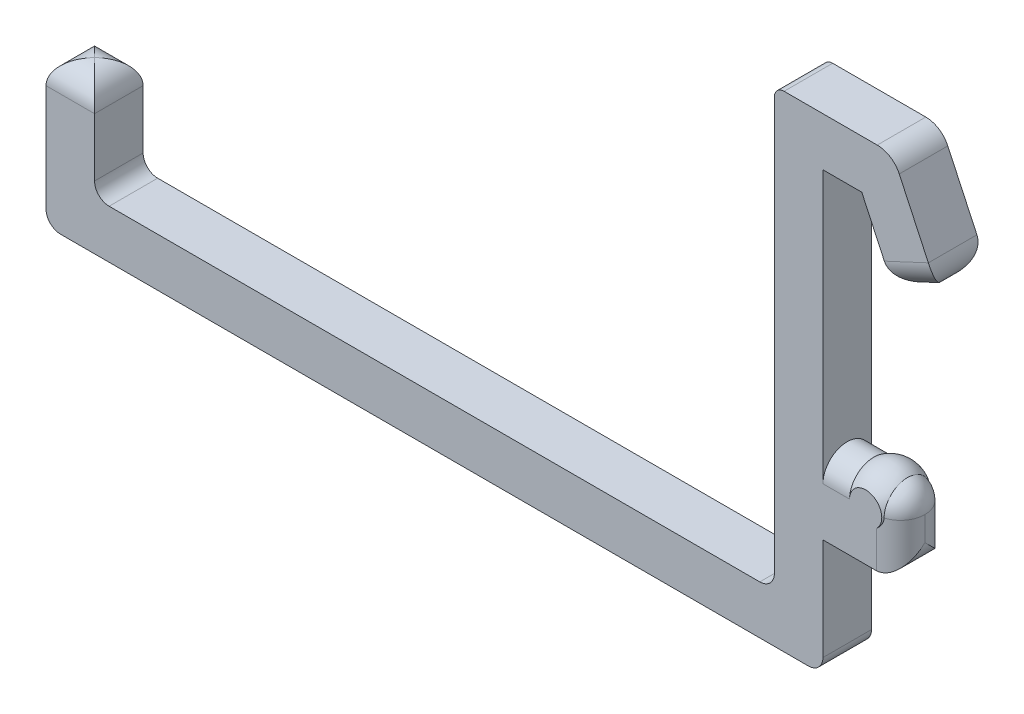
ISO-10303-21;
HEADER;
FILE_DESCRIPTION(('STEP AP214'),'2;1');
FILE_NAME('part.step','',(''),(''),'','','');
FILE_SCHEMA(('AUTOMOTIVE_DESIGN { 1 0 10303 214 1 1 1 1 }'));
ENDSEC;
DATA;
#1=APPLICATION_CONTEXT('core data for automotive mechanical design processes');
#2=APPLICATION_PROTOCOL_DEFINITION('international standard','automotive_design',2000,#1);
#3=PRODUCT_CONTEXT('',#1,'mechanical');
#4=PRODUCT('Part','Part','',(#3));
#5=PRODUCT_RELATED_PRODUCT_CATEGORY('part','',(#4));
#6=PRODUCT_DEFINITION_FORMATION('','',#4);
#7=PRODUCT_DEFINITION_CONTEXT('part definition',#1,'design');
#8=PRODUCT_DEFINITION('design','',#6,#7);
#9=PRODUCT_DEFINITION_SHAPE('','',#8);
#10=(LENGTH_UNIT() NAMED_UNIT(*) SI_UNIT(.MILLI.,.METRE.));
#11=(NAMED_UNIT(*) PLANE_ANGLE_UNIT() SI_UNIT($,.RADIAN.));
#12=(NAMED_UNIT(*) SI_UNIT($,.STERADIAN.) SOLID_ANGLE_UNIT());
#13=UNCERTAINTY_MEASURE_WITH_UNIT(LENGTH_MEASURE(1.E-05),#10,'distance_accuracy_value','');
#14=(GEOMETRIC_REPRESENTATION_CONTEXT(3) GLOBAL_UNCERTAINTY_ASSIGNED_CONTEXT((#13)) GLOBAL_UNIT_ASSIGNED_CONTEXT((#10,
#11,#12)) REPRESENTATION_CONTEXT('',''));
#15=CARTESIAN_POINT('',(0.,0.,0.));
#16=DIRECTION('',(0.,0.,1.));
#17=DIRECTION('',(1.,0.,0.));
#18=AXIS2_PLACEMENT_3D('',#15,#16,#17);
#19=CARTESIAN_POINT('',(13.5901699437495,0.,2.5));
#20=DIRECTION('',(-1.,0.,0.));
#21=DIRECTION('',(0.,0.,1.));
#22=AXIS2_PLACEMENT_3D('',#19,#20,#21);
#23=CYLINDRICAL_SURFACE('',#22,2.5);
#24=CARTESIAN_POINT('',(2.7416876048223,0.,2.5));
#25=DIRECTION('',(1.,0.,0.));
#26=DIRECTION('',(0.,0.,-1.));
#27=AXIS2_PLACEMENT_3D('',#24,#25,#26);
#28=CIRCLE('',#27,2.5);
#29=CARTESIAN_POINT('',(2.7416876048223,0.,0.));
#30=VERTEX_POINT('',#29);
#31=CARTESIAN_POINT('',(2.7416876048223,0.,5.));
#32=VERTEX_POINT('',#31);
#33=EDGE_CURVE('E235',#30,#32,#28,.T.);
#34=ORIENTED_EDGE('',*,*,#33,.F.);
#35=DIRECTION('',(-1.,0.,0.));
#36=VECTOR('',#35,1.);
#37=CARTESIAN_POINT('',(0.,0.,0.));
#38=LINE('',#37,#36);
#39=CARTESIAN_POINT('',(0.,0.,0.));
#40=VERTEX_POINT('',#39);
#41=EDGE_CURVE('E310',#30,#40,#38,.T.);
#42=ORIENTED_EDGE('',*,*,#41,.T.);
#43=CARTESIAN_POINT('',(0.,0.,2.5));
#44=DIRECTION('',(1.,0.,0.));
#45=DIRECTION('',(0.,0.,-1.));
#46=AXIS2_PLACEMENT_3D('',#43,#44,#45);
#47=CIRCLE('',#46,2.5);
#48=CARTESIAN_POINT('',(0.,0.,5.));
#49=VERTEX_POINT('',#48);
#50=EDGE_CURVE('E440',#40,#49,#47,.T.);
#51=ORIENTED_EDGE('',*,*,#50,.T.);
#52=DIRECTION('',(-1.,0.,0.));
#53=VECTOR('',#52,1.);
#54=CARTESIAN_POINT('',(0.,0.,5.));
#55=LINE('',#54,#53);
#56=EDGE_CURVE('E312',#32,#49,#55,.T.);
#57=ORIENTED_EDGE('',*,*,#56,.F.);
#58=EDGE_LOOP('',(#34,#42,#51,#57));
#59=FACE_BOUND('',#58,.T.);
#60=ADVANCED_FACE('F38',(#59),#23,.T.);
#61=CARTESIAN_POINT('',(5.5,0.,2.5));
#62=DIRECTION('',(0.,-1.,0.));
#63=DIRECTION('',(0.,0.,-1.));
#64=AXIS2_PLACEMENT_3D('',#61,#62,#63);
#65=CYLINDRICAL_SURFACE('',#64,2.5);
#66=DIRECTION('',(0.,1.,0.));
#67=VECTOR('',#66,1.);
#68=CARTESIAN_POINT('',(5.5,-5.,0.));
#69=LINE('',#68,#67);
#70=CARTESIAN_POINT('',(5.5,-1.24096736459909,0.));
#71=VERTEX_POINT('',#70);
#72=CARTESIAN_POINT('',(5.5,-5.,0.));
#73=VERTEX_POINT('',#72);
#74=EDGE_CURVE('E226',#71,#73,#69,.F.);
#75=ORIENTED_EDGE('',*,*,#74,.F.);
#76=CARTESIAN_POINT('',(5.4998,-1.24114463299005,8.00000016901504E-09));
#77=CARTESIAN_POINT('',(5.5363929673262,-1.2087029649529,-9.26164938524013E-06));
#78=CARTESIAN_POINT('',(5.57236876038989,-1.17555626849876,0.00079770122016531));
#79=CARTESIAN_POINT('',(5.6428030561148,-1.10769667819631,0.00383433659862395));
#80=CARTESIAN_POINT('',(5.67726031215857,-1.07298254322827,0.0060651555671746));
#81=CARTESIAN_POINT('',(5.74519128912905,-1.00095424317269,0.0118132669352872));
#82=CARTESIAN_POINT('',(5.77861573042543,-0.963595826296857,0.0153626740978217));
#83=CARTESIAN_POINT('',(5.84305795009588,-0.886981329738944,0.0234356736079334));
#84=CARTESIAN_POINT('',(5.8740762229525,-0.847725642663384,0.0279590650703918));
#85=CARTESIAN_POINT('',(5.96325201148396,-0.726269508254624,0.042561851108955));
#86=CARTESIAN_POINT('',(6.01705538420124,-0.640865596374251,0.0536260746175859));
#87=CARTESIAN_POINT('',(6.10655009460944,-0.461922147892546,0.074258393974845));
#88=CARTESIAN_POINT('',(6.14249859084772,-0.368522297372846,0.0838462716282918));
#89=CARTESIAN_POINT('',(6.17730370336194,-0.227795718404401,0.0934686773099391));
#90=CARTESIAN_POINT('',(6.18570287472368,-0.1829602446012,0.0958641595546958));
#91=CARTESIAN_POINT('',(6.19710907659667,-0.0920455434275466,0.0991560697495525));
#92=CARTESIAN_POINT('',(6.20005395659277,-0.0459579806521387,0.100035211650277));
#93=CARTESIAN_POINT('',(6.19999998181818,0.000200000000000188,0.0999999946969703));
#94=B_SPLINE_CURVE_WITH_KNOTS('',3,(#76,#77,#78,#79,#80,#81,#82,#83,#84,#85,#86,#87,#88,#89,#90,
#91,#92,#93),.UNSPECIFIED.,.F.,.F.,(4,2,2,2,2,2,2,2,4),(0.,0.146701218214616,0.29352070649968,
0.444179394748281,0.594807039223552,0.898088830284032,1.196865790681,1.3335683412279,
1.47181922641049),.UNSPECIFIED.);
#95=CARTESIAN_POINT('',(6.2,0.,0.100000000000001));
#96=VERTEX_POINT('',#95);
#97=EDGE_CURVE('E271',#71,#96,#94,.T.);
#98=ORIENTED_EDGE('',*,*,#97,.T.);
#99=CARTESIAN_POINT('',(5.5,0.,2.5));
#100=DIRECTION('',(0.,1.,0.));
#101=DIRECTION('',(0.,0.,1.));
#102=AXIS2_PLACEMENT_3D('',#99,#100,#101);
#103=CIRCLE('',#102,2.5);
#104=CARTESIAN_POINT('',(8.,0.,2.5));
#105=VERTEX_POINT('',#104);
#106=EDGE_CURVE('E471',#105,#96,#103,.T.);
#107=ORIENTED_EDGE('',*,*,#106,.F.);
#108=DIRECTION('',(0.,1.,0.));
#109=VECTOR('',#108,1.);
#110=CARTESIAN_POINT('',(8.,0.,2.5));
#111=LINE('',#110,#109);
#112=CARTESIAN_POINT('',(8.,-2.5,2.5));
#113=VERTEX_POINT('',#112);
#114=EDGE_CURVE('E469',#113,#105,#111,.T.);
#115=ORIENTED_EDGE('',*,*,#114,.F.);
#116=CARTESIAN_POINT('',(5.5,-2.5,2.5));
#117=DIRECTION('',(0.,0.707106781186547,-0.707106781186547));
#118=DIRECTION('',(0.,-0.707106781186547,-0.707106781186547));
#119=AXIS2_PLACEMENT_3D('',#116,#117,#118);
#120=ELLIPSE('',#119,3.53553390593274,2.5);
#121=EDGE_CURVE('E257',#73,#113,#120,.F.);
#122=ORIENTED_EDGE('',*,*,#121,.F.);
#123=EDGE_LOOP('',(#75,#98,#107,#115,#122));
#124=FACE_BOUND('',#123,.T.);
#125=ADVANCED_FACE('F283',(#124),#65,.T.);
#126=CARTESIAN_POINT('',(5.5,0.,2.5));
#127=DIRECTION('',(-1.,0.,0.));
#128=DIRECTION('',(0.,0.,1.));
#129=AXIS2_PLACEMENT_3D('',#126,#127,#128);
#130=SPHERICAL_SURFACE('',#129,2.5);
#131=ORIENTED_EDGE('',*,*,#106,.T.);
#132=CARTESIAN_POINT('',(6.2,0.,2.5));
#133=DIRECTION('',(-1.,0.,0.));
#134=DIRECTION('',(0.,0.,1.));
#135=AXIS2_PLACEMENT_3D('',#132,#133,#134);
#136=CIRCLE('',#135,2.4);
#137=CARTESIAN_POINT('',(6.2,0.,4.9));
#138=VERTEX_POINT('',#137);
#139=EDGE_CURVE('E281',#96,#138,#136,.F.);
#140=ORIENTED_EDGE('',*,*,#139,.T.);
#141=CARTESIAN_POINT('',(5.5,0.,2.5));
#142=DIRECTION('',(0.,-1.,0.));
#143=DIRECTION('',(0.,0.,-1.));
#144=AXIS2_PLACEMENT_3D('',#141,#142,#143);
#145=CIRCLE('',#144,2.5);
#146=EDGE_CURVE('E244',#105,#138,#145,.T.);
#147=ORIENTED_EDGE('',*,*,#146,.F.);
#148=EDGE_LOOP('',(#131,#140,#147));
#149=FACE_BOUND('',#148,.T.);
#150=ADVANCED_FACE('F288',(#149),#130,.T.);
#151=CARTESIAN_POINT('',(5.5,0.,2.5));
#152=DIRECTION('',(0.,1.,0.));
#153=DIRECTION('',(0.,0.,1.));
#154=AXIS2_PLACEMENT_3D('',#151,#152,#153);
#155=CYLINDRICAL_SURFACE('',#154,2.5);
#156=ORIENTED_EDGE('',*,*,#146,.T.);
#157=CARTESIAN_POINT('',(6.19999998181818,0.0002,4.90000000530303));
#158=CARTESIAN_POINT('',(6.20002060593483,-0.0340215820751625,4.8999881731683));
#159=CARTESIAN_POINT('',(6.1984143593459,-0.0682209096207422,4.90046286433432));
#160=CARTESIAN_POINT('',(6.19208379810463,-0.136249463080852,4.90229830533756));
#161=CARTESIAN_POINT('',(6.18736474729119,-0.170079215952131,4.90365755930238));
#162=CARTESIAN_POINT('',(6.1689482938362,-0.269536910764676,4.90887369332737));
#163=CARTESIAN_POINT('',(6.15098131886339,-0.334336983187606,4.91387497360715));
#164=CARTESIAN_POINT('',(6.09808868579219,-0.480851170246759,4.92759913373652));
#165=CARTESIAN_POINT('',(6.05953499991633,-0.561148858343043,4.9370045157109));
#166=CARTESIAN_POINT('',(5.97007827325949,-0.715449277029459,4.95583685420229));
#167=CARTESIAN_POINT('',(5.91904380010561,-0.789372868652353,4.96526290588241));
#168=CARTESIAN_POINT('',(5.80922506209963,-0.929818254648964,4.98141526656959));
#169=CARTESIAN_POINT('',(5.75055545651682,-0.996426935956446,4.98817650123594));
#170=CARTESIAN_POINT('',(5.65870838300495,-1.09170672728009,4.99514321976577));
#171=CARTESIAN_POINT('',(5.62774086496115,-1.12244386881611,4.99693401300135));
#172=CARTESIAN_POINT('',(5.56461568283012,-1.1826876244331,4.99936451304459));
#173=CARTESIAN_POINT('',(5.5324586096933,-1.21219483443042,5.00000478377816));
#174=CARTESIAN_POINT('',(5.4998,-1.24114463299005,4.999999992));
#175=B_SPLINE_CURVE_WITH_KNOTS('',3,(#157,#158,#159,#160,#161,#162,#163,#164,#165,#166,#167,
#168,#169,#170,#171,#172,#173,#174),.UNSPECIFIED.,.F.,.F.,(4,2,2,2,2,2,2,2,4),(0.,
0.102583403755103,0.204993779301411,0.406260766109181,0.673486519863846,0.943657669752398,
1.21015973265302,1.34112701736425,1.47203009124063),.UNSPECIFIED.);
#176=CARTESIAN_POINT('',(5.5,-1.24096736459909,5.));
#177=VERTEX_POINT('',#176);
#178=EDGE_CURVE('E232',#138,#177,#175,.T.);
#179=ORIENTED_EDGE('',*,*,#178,.T.);
#180=DIRECTION('',(0.,1.,0.));
#181=VECTOR('',#180,1.);
#182=CARTESIAN_POINT('',(5.5,0.,5.));
#183=LINE('',#182,#181);
#184=CARTESIAN_POINT('',(5.5,-5.,5.));
#185=VERTEX_POINT('',#184);
#186=EDGE_CURVE('E214',#185,#177,#183,.T.);
#187=ORIENTED_EDGE('',*,*,#186,.F.);
#188=CARTESIAN_POINT('',(5.5,-2.5,2.5));
#189=DIRECTION('',(0.,-0.707106781186547,-0.707106781186547));
#190=DIRECTION('',(0.,0.707106781186547,-0.707106781186547));
#191=AXIS2_PLACEMENT_3D('',#188,#189,#190);
#192=ELLIPSE('',#191,3.53553390593274,2.5);
#193=EDGE_CURVE('E466',#185,#113,#192,.F.);
#194=ORIENTED_EDGE('',*,*,#193,.T.);
#195=ORIENTED_EDGE('',*,*,#114,.T.);
#196=EDGE_LOOP('',(#156,#179,#187,#194,#195));
#197=FACE_BOUND('',#196,.T.);
#198=ADVANCED_FACE('F241',(#197),#155,.T.);
#199=CARTESIAN_POINT('',(0.,0.,5.));
#200=DIRECTION('',(-1.,0.,0.));
#201=DIRECTION('',(0.,0.,1.));
#202=AXIS2_PLACEMENT_3D('',#199,#200,#201);
#203=PLANE('',#202);
#204=ORIENTED_EDGE('',*,*,#50,.F.);
#205=DIRECTION('',(0.,1.,0.));
#206=VECTOR('',#205,1.);
#207=CARTESIAN_POINT('',(0.,0.,0.));
#208=LINE('',#207,#206);
#209=CARTESIAN_POINT('',(0.,28.,0.));
#210=VERTEX_POINT('',#209);
#211=EDGE_CURVE('E318',#40,#210,#208,.T.);
#212=ORIENTED_EDGE('',*,*,#211,.T.);
#213=DIRECTION('',(0.,0.,-1.));
#214=VECTOR('',#213,1.);
#215=CARTESIAN_POINT('',(0.,28.,5.));
#216=LINE('',#215,#214);
#217=CARTESIAN_POINT('',(0.,28.,5.));
#218=VERTEX_POINT('',#217);
#219=EDGE_CURVE('E379',#218,#210,#216,.T.);
#220=ORIENTED_EDGE('',*,*,#219,.F.);
#221=DIRECTION('',(0.,1.,0.));
#222=VECTOR('',#221,1.);
#223=CARTESIAN_POINT('',(0.,0.,5.));
#224=LINE('',#223,#222);
#225=EDGE_CURVE('E484',#49,#218,#224,.T.);
#226=ORIENTED_EDGE('',*,*,#225,.F.);
#227=EDGE_LOOP('',(#204,#212,#220,#226));
#228=FACE_BOUND('',#227,.T.);
#229=ADVANCED_FACE('F676',(#228),#203,.F.);
#230=CARTESIAN_POINT('',(0.,28.,5.));
#231=DIRECTION('',(0.,1.,0.));
#232=DIRECTION('',(0.,0.,1.));
#233=AXIS2_PLACEMENT_3D('',#230,#231,#232);
#234=PLANE('',#233);
#235=DIRECTION('',(1.,0.,0.));
#236=VECTOR('',#235,1.);
#237=CARTESIAN_POINT('',(0.,28.,0.));
#238=LINE('',#237,#236);
#239=CARTESIAN_POINT('',(4.,28.,0.));
#240=VERTEX_POINT('',#239);
#241=EDGE_CURVE('E325',#210,#240,#238,.T.);
#242=ORIENTED_EDGE('',*,*,#241,.T.);
#243=DIRECTION('',(0.,0.,-1.));
#244=VECTOR('',#243,1.);
#245=CARTESIAN_POINT('',(4.,28.,5.));
#246=LINE('',#245,#244);
#247=CARTESIAN_POINT('',(4.,28.,5.));
#248=VERTEX_POINT('',#247);
#249=EDGE_CURVE('E375',#248,#240,#246,.T.);
#250=ORIENTED_EDGE('',*,*,#249,.F.);
#251=DIRECTION('',(1.,0.,0.));
#252=VECTOR('',#251,1.);
#253=CARTESIAN_POINT('',(0.,28.,5.));
#254=LINE('',#253,#252);
#255=EDGE_CURVE('E487',#218,#248,#254,.T.);
#256=ORIENTED_EDGE('',*,*,#255,.F.);
#257=ORIENTED_EDGE('',*,*,#219,.T.);
#258=EDGE_LOOP('',(#242,#250,#256,#257));
#259=FACE_BOUND('',#258,.T.);
#260=ADVANCED_FACE('F672',(#259),#234,.F.);
#261=CARTESIAN_POINT('',(4.,28.,5.));
#262=DIRECTION('',(0.906307787036651,0.422618261740697,0.));
#263=DIRECTION('',(-0.422618261740697,0.906307787036651,0.));
#264=AXIS2_PLACEMENT_3D('',#261,#262,#263);
#265=PLANE('',#264);
#266=DIRECTION('',(0.422618261740697,-0.906307787036651,0.));
#267=VECTOR('',#266,1.);
#268=CARTESIAN_POINT('',(4.,28.,0.));
#269=LINE('',#268,#267);
#270=CARTESIAN_POINT('',(6.32440043957384,23.0153071712984,0.));
#271=VERTEX_POINT('',#270);
#272=EDGE_CURVE('E335',#240,#271,#269,.T.);
#273=ORIENTED_EDGE('',*,*,#272,.T.);
#274=DIRECTION('',(0.,0.,-1.));
#275=VECTOR('',#274,1.);
#276=CARTESIAN_POINT('',(6.32440043957383,23.0153071712984,5.));
#277=LINE('',#276,#275);
#278=CARTESIAN_POINT('',(6.32440043957384,23.0153071712984,5.));
#279=VERTEX_POINT('',#278);
#280=EDGE_CURVE('E383',#271,#279,#277,.F.);
#281=ORIENTED_EDGE('',*,*,#280,.T.);
#282=DIRECTION('',(0.422618261740697,-0.906307787036651,0.));
#283=VECTOR('',#282,1.);
#284=CARTESIAN_POINT('',(4.,28.,5.));
#285=LINE('',#284,#283);
#286=EDGE_CURVE('E490',#248,#279,#285,.T.);
#287=ORIENTED_EDGE('',*,*,#286,.F.);
#288=ORIENTED_EDGE('',*,*,#249,.T.);
#289=EDGE_LOOP('',(#273,#281,#287,#288));
#290=FACE_BOUND('',#289,.T.);
#291=ADVANCED_FACE('F667',(#290),#265,.F.);
#292=CARTESIAN_POINT('',(11.9124850291088,22.8626290124103,5.));
#293=DIRECTION('',(-0.906307787036651,-0.422618261740697,0.));
#294=DIRECTION('',(0.422618261740697,-0.906307787036651,0.));
#295=AXIS2_PLACEMENT_3D('',#292,#293,#294);
#296=PLANE('',#295);
#297=DIRECTION('',(-0.422618261740697,0.906307787036651,0.));
#298=VECTOR('',#297,1.);
#299=CARTESIAN_POINT('',(11.9124850291088,22.8626290124103,5.));
#300=LINE('',#299,#298);
#301=CARTESIAN_POINT('',(10.8559393747571,25.1283984800019,5.));
#302=VERTEX_POINT('',#301);
#303=CARTESIAN_POINT('',(7.85844511961037,31.5565456543517,5.));
#304=VERTEX_POINT('',#303);
#305=EDGE_CURVE('E494',#302,#304,#300,.T.);
#306=ORIENTED_EDGE('',*,*,#305,.F.);
#307=DIRECTION('',(0.,0.,-1.));
#308=VECTOR('',#307,1.);
#309=CARTESIAN_POINT('',(10.8559393747571,25.1283984800019,5.));
#310=LINE('',#309,#308);
#311=CARTESIAN_POINT('',(10.8559393747571,25.1283984800019,0.));
#312=VERTEX_POINT('',#311);
#313=EDGE_CURVE('E399',#302,#312,#310,.T.);
#314=ORIENTED_EDGE('',*,*,#313,.T.);
#315=DIRECTION('',(-0.422618261740697,0.906307787036651,0.));
#316=VECTOR('',#315,1.);
#317=CARTESIAN_POINT('',(11.9124850291088,22.8626290124103,0.));
#318=LINE('',#317,#316);
#319=CARTESIAN_POINT('',(7.85844511961037,31.5565456543517,0.));
#320=VERTEX_POINT('',#319);
#321=EDGE_CURVE('E339',#312,#320,#318,.T.);
#322=ORIENTED_EDGE('',*,*,#321,.T.);
#323=DIRECTION('',(0.,0.,-1.));
#324=VECTOR('',#323,1.);
#325=CARTESIAN_POINT('',(7.85844511961037,31.5565456543517,5.));
#326=LINE('',#325,#324);
#327=EDGE_CURVE('E396',#320,#304,#326,.F.);
#328=ORIENTED_EDGE('',*,*,#327,.T.);
#329=EDGE_LOOP('',(#306,#314,#322,#328));
#330=FACE_BOUND('',#329,.T.);
#331=ADVANCED_FACE('F653',(#330),#296,.F.);
#332=CARTESIAN_POINT('',(-5.,33.,5.));
#333=DIRECTION('',(0.,-1.,0.));
#334=DIRECTION('',(0.,0.,-1.));
#335=AXIS2_PLACEMENT_3D('',#332,#333,#334);
#336=PLANE('',#335);
#337=DIRECTION('',(-1.,0.,0.));
#338=VECTOR('',#337,1.);
#339=CARTESIAN_POINT('',(-5.,33.,0.));
#340=LINE('',#339,#338);
#341=CARTESIAN_POINT('',(5.59267565201873,33.,0.));
#342=VERTEX_POINT('',#341);
#343=CARTESIAN_POINT('',(-4.,33.,0.));
#344=VERTEX_POINT('',#343);
#345=EDGE_CURVE('E343',#342,#344,#340,.T.);
#346=ORIENTED_EDGE('',*,*,#345,.T.);
#347=DIRECTION('',(0.,0.,-1.));
#348=VECTOR('',#347,1.);
#349=CARTESIAN_POINT('',(-4.,33.,5.));
#350=LINE('',#349,#348);
#351=CARTESIAN_POINT('',(-4.,33.,5.));
#352=VERTEX_POINT('',#351);
#353=EDGE_CURVE('E457',#344,#352,#350,.F.);
#354=ORIENTED_EDGE('',*,*,#353,.T.);
#355=DIRECTION('',(-1.,0.,0.));
#356=VECTOR('',#355,1.);
#357=CARTESIAN_POINT('',(-5.,33.,5.));
#358=LINE('',#357,#356);
#359=CARTESIAN_POINT('',(5.59267565201873,33.,5.));
#360=VERTEX_POINT('',#359);
#361=EDGE_CURVE('E498',#360,#352,#358,.T.);
#362=ORIENTED_EDGE('',*,*,#361,.F.);
#363=DIRECTION('',(0.,0.,-1.));
#364=VECTOR('',#363,1.);
#365=CARTESIAN_POINT('',(5.59267565201874,33.,5.));
#366=LINE('',#365,#364);
#367=EDGE_CURVE('E419',#360,#342,#366,.T.);
#368=ORIENTED_EDGE('',*,*,#367,.T.);
#369=EDGE_LOOP('',(#346,#354,#362,#368));
#370=FACE_BOUND('',#369,.T.);
#371=ADVANCED_FACE('F645',(#370),#336,.F.);
#372=CARTESIAN_POINT('',(-5.,33.,5.));
#373=DIRECTION('',(1.,0.,0.));
#374=DIRECTION('',(0.,1.,0.));
#375=AXIS2_PLACEMENT_3D('',#372,#373,#374);
#376=PLANE('',#375);
#377=DIRECTION('',(0.,-1.,0.));
#378=VECTOR('',#377,1.);
#379=CARTESIAN_POINT('',(-5.,33.,0.));
#380=LINE('',#379,#378);
#381=CARTESIAN_POINT('',(-5.,32.,0.));
#382=VERTEX_POINT('',#381);
#383=CARTESIAN_POINT('',(-4.99999999999999,-10.5,0.));
#384=VERTEX_POINT('',#383);
#385=EDGE_CURVE('E347',#382,#384,#380,.T.);
#386=ORIENTED_EDGE('',*,*,#385,.T.);
#387=DIRECTION('',(0.,0.,-1.));
#388=VECTOR('',#387,1.);
#389=CARTESIAN_POINT('',(-4.99999999999999,-10.5,5.));
#390=LINE('',#389,#388);
#391=CARTESIAN_POINT('',(-4.99999999999999,-10.5,5.));
#392=VERTEX_POINT('',#391);
#393=EDGE_CURVE('E571',#384,#392,#390,.F.);
#394=ORIENTED_EDGE('',*,*,#393,.T.);
#395=DIRECTION('',(0.,-1.,0.));
#396=VECTOR('',#395,1.);
#397=CARTESIAN_POINT('',(-5.,33.,5.));
#398=LINE('',#397,#396);
#399=CARTESIAN_POINT('',(-5.,32.,5.));
#400=VERTEX_POINT('',#399);
#401=EDGE_CURVE('E502',#400,#392,#398,.T.);
#402=ORIENTED_EDGE('',*,*,#401,.F.);
#403=DIRECTION('',(0.,0.,-1.));
#404=VECTOR('',#403,1.);
#405=CARTESIAN_POINT('',(-5.,32.,5.));
#406=LINE('',#405,#404);
#407=EDGE_CURVE('E423',#400,#382,#406,.T.);
#408=ORIENTED_EDGE('',*,*,#407,.T.);
#409=EDGE_LOOP('',(#386,#394,#402,#408));
#410=FACE_BOUND('',#409,.T.);
#411=ADVANCED_FACE('F640',(#410),#376,.F.);
#412=CARTESIAN_POINT('',(-75.,-12.,5.));
#413=DIRECTION('',(0.,-1.,0.));
#414=DIRECTION('',(0.,0.,-1.));
#415=AXIS2_PLACEMENT_3D('',#412,#413,#414);
#416=PLANE('',#415);
#417=DIRECTION('',(-1.,0.,0.));
#418=VECTOR('',#417,1.);
#419=CARTESIAN_POINT('',(-75.,-12.,5.));
#420=LINE('',#419,#418);
#421=CARTESIAN_POINT('',(-6.50000000000001,-12.,5.));
#422=VERTEX_POINT('',#421);
#423=CARTESIAN_POINT('',(-73.5,-12.,5.));
#424=VERTEX_POINT('',#423);
#425=EDGE_CURVE('E506',#422,#424,#420,.T.);
#426=ORIENTED_EDGE('',*,*,#425,.F.);
#427=DIRECTION('',(0.,0.,-1.));
#428=VECTOR('',#427,1.);
#429=CARTESIAN_POINT('',(-6.50000000000001,-12.,0.));
#430=LINE('',#429,#428);
#431=CARTESIAN_POINT('',(-6.50000000000001,-12.,0.));
#432=VERTEX_POINT('',#431);
#433=EDGE_CURVE('E574',#422,#432,#430,.T.);
#434=ORIENTED_EDGE('',*,*,#433,.T.);
#435=DIRECTION('',(-1.,0.,0.));
#436=VECTOR('',#435,1.);
#437=CARTESIAN_POINT('',(-75.,-12.,0.));
#438=LINE('',#437,#436);
#439=CARTESIAN_POINT('',(-73.5,-12.,0.));
#440=VERTEX_POINT('',#439);
#441=EDGE_CURVE('E351',#432,#440,#438,.T.);
#442=ORIENTED_EDGE('',*,*,#441,.T.);
#443=DIRECTION('',(0.,0.,-1.));
#444=VECTOR('',#443,1.);
#445=CARTESIAN_POINT('',(-73.5,-12.,5.));
#446=LINE('',#445,#444);
#447=EDGE_CURVE('E578',#440,#424,#446,.F.);
#448=ORIENTED_EDGE('',*,*,#447,.T.);
#449=EDGE_LOOP('',(#426,#434,#442,#448));
#450=FACE_BOUND('',#449,.T.);
#451=ADVANCED_FACE('F584',(#450),#416,.F.);
#452=CARTESIAN_POINT('',(-75.,-12.,5.));
#453=DIRECTION('',(-1.,0.,0.));
#454=DIRECTION('',(0.,0.,1.));
#455=AXIS2_PLACEMENT_3D('',#452,#453,#454);
#456=PLANE('',#455);
#457=DIRECTION('',(0.,1.,0.));
#458=VECTOR('',#457,1.);
#459=CARTESIAN_POINT('',(-75.,-12.,5.));
#460=LINE('',#459,#458);
#461=CARTESIAN_POINT('',(-75.,-10.5,5.));
#462=VERTEX_POINT('',#461);
#463=CARTESIAN_POINT('',(-75.,-4.5,5.));
#464=VERTEX_POINT('',#463);
#465=EDGE_CURVE('E510',#462,#464,#460,.T.);
#466=ORIENTED_EDGE('',*,*,#465,.F.);
#467=DIRECTION('',(0.,0.,-1.));
#468=VECTOR('',#467,1.);
#469=CARTESIAN_POINT('',(-75.,-10.5,0.));
#470=LINE('',#469,#468);
#471=CARTESIAN_POINT('',(-75.,-10.5,0.));
#472=VERTEX_POINT('',#471);
#473=EDGE_CURVE('E567',#462,#472,#470,.T.);
#474=ORIENTED_EDGE('',*,*,#473,.T.);
#475=DIRECTION('',(0.,1.,0.));
#476=VECTOR('',#475,1.);
#477=CARTESIAN_POINT('',(-75.,-12.,0.));
#478=LINE('',#477,#476);
#479=CARTESIAN_POINT('',(-75.,-4.5,0.));
#480=VERTEX_POINT('',#479);
#481=EDGE_CURVE('E355',#472,#480,#478,.T.);
#482=ORIENTED_EDGE('',*,*,#481,.T.);
#483=DIRECTION('',(0.,0.,-1.));
#484=VECTOR('',#483,1.);
#485=CARTESIAN_POINT('',(-75.,-4.5,5.));
#486=LINE('',#485,#484);
#487=EDGE_CURVE('E412',#480,#464,#486,.F.);
#488=ORIENTED_EDGE('',*,*,#487,.T.);
#489=EDGE_LOOP('',(#466,#474,#482,#488));
#490=FACE_BOUND('',#489,.T.);
#491=ADVANCED_FACE('F593',(#490),#456,.F.);
#492=CARTESIAN_POINT('',(-80.,-2.,5.));
#493=DIRECTION('',(1.,0.,0.));
#494=DIRECTION('',(0.,0.,-1.));
#495=AXIS2_PLACEMENT_3D('',#492,#493,#494);
#496=PLANE('',#495);
#497=DIRECTION('',(0.,-1.,0.));
#498=VECTOR('',#497,1.);
#499=CARTESIAN_POINT('',(-80.,-2.,0.));
#500=LINE('',#499,#498);
#501=CARTESIAN_POINT('',(-80.,-4.5,0.));
#502=VERTEX_POINT('',#501);
#503=CARTESIAN_POINT('',(-80.,-15.5,0.));
#504=VERTEX_POINT('',#503);
#505=EDGE_CURVE('E358',#502,#504,#500,.T.);
#506=ORIENTED_EDGE('',*,*,#505,.T.);
#507=DIRECTION('',(0.,0.,-1.));
#508=VECTOR('',#507,1.);
#509=CARTESIAN_POINT('',(-80.,-15.5,5.));
#510=LINE('',#509,#508);
#511=CARTESIAN_POINT('',(-80.,-15.5,5.));
#512=VERTEX_POINT('',#511);
#513=EDGE_CURVE('E11',#504,#512,#510,.F.);
#514=ORIENTED_EDGE('',*,*,#513,.T.);
#515=DIRECTION('',(0.,-1.,0.));
#516=VECTOR('',#515,1.);
#517=CARTESIAN_POINT('',(-80.,-2.,5.));
#518=LINE('',#517,#516);
#519=CARTESIAN_POINT('',(-80.,-4.5,5.));
#520=VERTEX_POINT('',#519);
#521=EDGE_CURVE('E513',#520,#512,#518,.T.);
#522=ORIENTED_EDGE('',*,*,#521,.F.);
#523=DIRECTION('',(0.,0.,-1.));
#524=VECTOR('',#523,1.);
#525=CARTESIAN_POINT('',(-80.,-4.5,5.));
#526=LINE('',#525,#524);
#527=EDGE_CURVE('E416',#520,#502,#526,.T.);
#528=ORIENTED_EDGE('',*,*,#527,.T.);
#529=EDGE_LOOP('',(#506,#514,#522,#528));
#530=FACE_BOUND('',#529,.T.);
#531=ADVANCED_FACE('F610',(#530),#496,.F.);
#532=CARTESIAN_POINT('',(-80.,-17.,5.));
#533=DIRECTION('',(0.,1.,0.));
#534=DIRECTION('',(0.,0.,1.));
#535=AXIS2_PLACEMENT_3D('',#532,#533,#534);
#536=PLANE('',#535);
#537=DIRECTION('',(1.,0.,0.));
#538=VECTOR('',#537,1.);
#539=CARTESIAN_POINT('',(-80.,-17.,0.));
#540=LINE('',#539,#538);
#541=CARTESIAN_POINT('',(-78.5,-17.,0.));
#542=VERTEX_POINT('',#541);
#543=CARTESIAN_POINT('',(-1.5,-17.,0.));
#544=VERTEX_POINT('',#543);
#545=EDGE_CURVE('E361',#542,#544,#540,.T.);
#546=ORIENTED_EDGE('',*,*,#545,.T.);
#547=DIRECTION('',(0.,0.,-1.));
#548=VECTOR('',#547,1.);
#549=CARTESIAN_POINT('',(-1.5,-17.,5.));
#550=LINE('',#549,#548);
#551=CARTESIAN_POINT('',(-1.5,-17.,5.));
#552=VERTEX_POINT('',#551);
#553=EDGE_CURVE('E60',#544,#552,#550,.F.);
#554=ORIENTED_EDGE('',*,*,#553,.T.);
#555=DIRECTION('',(1.,0.,0.));
#556=VECTOR('',#555,1.);
#557=CARTESIAN_POINT('',(-80.,-17.,5.));
#558=LINE('',#557,#556);
#559=CARTESIAN_POINT('',(-78.5,-17.,5.));
#560=VERTEX_POINT('',#559);
#561=EDGE_CURVE('E516',#560,#552,#558,.T.);
#562=ORIENTED_EDGE('',*,*,#561,.F.);
#563=DIRECTION('',(0.,0.,-1.));
#564=VECTOR('',#563,1.);
#565=CARTESIAN_POINT('',(-78.5,-17.,5.));
#566=LINE('',#565,#564);
#567=EDGE_CURVE('E535',#560,#542,#566,.T.);
#568=ORIENTED_EDGE('',*,*,#567,.T.);
#569=EDGE_LOOP('',(#546,#554,#562,#568));
#570=FACE_BOUND('',#569,.T.);
#571=ADVANCED_FACE('F539',(#570),#536,.F.);
#572=CARTESIAN_POINT('',(0.,-5.,5.));
#573=DIRECTION('',(-1.,0.,0.));
#574=DIRECTION('',(0.,0.,1.));
#575=AXIS2_PLACEMENT_3D('',#572,#573,#574);
#576=PLANE('',#575);
#577=DIRECTION('',(0.,1.,0.));
#578=VECTOR('',#577,1.);
#579=CARTESIAN_POINT('',(0.,-5.,5.));
#580=LINE('',#579,#578);
#581=CARTESIAN_POINT('',(0.,-15.5,5.));
#582=VERTEX_POINT('',#581);
#583=CARTESIAN_POINT('',(0.,-5.,5.));
#584=VERTEX_POINT('',#583);
#585=EDGE_CURVE('E518',#582,#584,#580,.T.);
#586=ORIENTED_EDGE('',*,*,#585,.F.);
#587=DIRECTION('',(0.,0.,-1.));
#588=VECTOR('',#587,1.);
#589=CARTESIAN_POINT('',(0.,-15.5,5.));
#590=LINE('',#589,#588);
#591=CARTESIAN_POINT('',(0.,-15.5,0.));
#592=VERTEX_POINT('',#591);
#593=EDGE_CURVE('E552',#582,#592,#590,.T.);
#594=ORIENTED_EDGE('',*,*,#593,.T.);
#595=DIRECTION('',(0.,1.,0.));
#596=VECTOR('',#595,1.);
#597=CARTESIAN_POINT('',(0.,-5.,0.));
#598=LINE('',#597,#596);
#599=CARTESIAN_POINT('',(0.,-5.,0.));
#600=VERTEX_POINT('',#599);
#601=EDGE_CURVE('E364',#592,#600,#598,.T.);
#602=ORIENTED_EDGE('',*,*,#601,.T.);
#603=DIRECTION('',(0.,0.,-1.));
#604=VECTOR('',#603,1.);
#605=CARTESIAN_POINT('',(0.,-5.,5.));
#606=LINE('',#605,#604);
#607=EDGE_CURVE('E371',#584,#600,#606,.T.);
#608=ORIENTED_EDGE('',*,*,#607,.F.);
#609=EDGE_LOOP('',(#586,#594,#602,#608));
#610=FACE_BOUND('',#609,.T.);
#611=ADVANCED_FACE('F526',(#610),#576,.F.);
#612=CARTESIAN_POINT('',(8.,-5.,5.));
#613=DIRECTION('',(0.,1.,0.));
#614=DIRECTION('',(0.,0.,1.));
#615=AXIS2_PLACEMENT_3D('',#612,#613,#614);
#616=PLANE('',#615);
#617=DIRECTION('',(1.,0.,0.));
#618=VECTOR('',#617,1.);
#619=CARTESIAN_POINT('',(8.,-5.,0.));
#620=LINE('',#619,#618);
#621=EDGE_CURVE('E367',#600,#73,#620,.T.);
#622=ORIENTED_EDGE('',*,*,#621,.T.);
#623=DIRECTION('',(0.,0.,-1.));
#624=VECTOR('',#623,1.);
#625=CARTESIAN_POINT('',(5.5,-5.,5.));
#626=LINE('',#625,#624);
#627=EDGE_CURVE('E246',#73,#185,#626,.F.);
#628=ORIENTED_EDGE('',*,*,#627,.T.);
#629=DIRECTION('',(1.,0.,0.));
#630=VECTOR('',#629,1.);
#631=CARTESIAN_POINT('',(8.,-5.,5.));
#632=LINE('',#631,#630);
#633=EDGE_CURVE('E220',#584,#185,#632,.T.);
#634=ORIENTED_EDGE('',*,*,#633,.F.);
#635=ORIENTED_EDGE('',*,*,#607,.T.);
#636=EDGE_LOOP('',(#622,#628,#634,#635));
#637=FACE_BOUND('',#636,.T.);
#638=ADVANCED_FACE('F529',(#637),#616,.F.);
#639=CARTESIAN_POINT('',(0.,0.,5.));
#640=DIRECTION('',(0.,0.,-1.));
#641=DIRECTION('',(-1.,0.,0.));
#642=AXIS2_PLACEMENT_3D('',#639,#640,#641);
#643=PLANE('',#642);
#644=ORIENTED_EDGE('',*,*,#561,.T.);
#645=CARTESIAN_POINT('',(-1.5,-15.5,5.));
#646=DIRECTION('',(0.,0.,-1.));
#647=DIRECTION('',(-1.,0.,0.));
#648=AXIS2_PLACEMENT_3D('',#645,#646,#647);
#649=CIRCLE('',#648,1.5);
#650=EDGE_CURVE('E47',#552,#582,#649,.F.);
#651=ORIENTED_EDGE('',*,*,#650,.T.);
#652=ORIENTED_EDGE('',*,*,#585,.T.);
#653=ORIENTED_EDGE('',*,*,#633,.T.);
#654=ORIENTED_EDGE('',*,*,#186,.T.);
#655=CARTESIAN_POINT('',(4.4,0.,5.));
#656=DIRECTION('',(0.,0.,-1.));
#657=DIRECTION('',(-1.,0.,0.));
#658=AXIS2_PLACEMENT_3D('',#655,#656,#657);
#659=CIRCLE('',#658,1.6583123951777);
#660=EDGE_CURVE('E217',#32,#177,#659,.T.);
#661=ORIENTED_EDGE('',*,*,#660,.F.);
#662=ORIENTED_EDGE('',*,*,#56,.T.);
#663=ORIENTED_EDGE('',*,*,#225,.T.);
#664=ORIENTED_EDGE('',*,*,#255,.T.);
#665=ORIENTED_EDGE('',*,*,#286,.T.);
#666=DIRECTION('',(0.906307787036651,0.422618261740698,0.));
#667=VECTOR('',#666,1.);
#668=CARTESIAN_POINT('',(-7.68579698346491,16.4822448206721,5.));
#669=LINE('',#668,#667);
#670=EDGE_CURVE('E393',#279,#302,#669,.T.);
#671=ORIENTED_EDGE('',*,*,#670,.T.);
#672=ORIENTED_EDGE('',*,*,#305,.T.);
#673=CARTESIAN_POINT('',(5.59267565201874,30.5,5.));
#674=DIRECTION('',(0.,0.,-1.));
#675=DIRECTION('',(-1.,0.,0.));
#676=AXIS2_PLACEMENT_3D('',#673,#674,#675);
#677=CIRCLE('',#676,2.5);
#678=EDGE_CURVE('E387',#304,#360,#677,.F.);
#679=ORIENTED_EDGE('',*,*,#678,.T.);
#680=ORIENTED_EDGE('',*,*,#361,.T.);
#681=CARTESIAN_POINT('',(-4.,32.,5.));
#682=DIRECTION('',(0.,0.,-1.));
#683=DIRECTION('',(-1.,0.,0.));
#684=AXIS2_PLACEMENT_3D('',#681,#682,#683);
#685=CIRCLE('',#684,1.);
#686=EDGE_CURVE('E227',#352,#400,#685,.F.);
#687=ORIENTED_EDGE('',*,*,#686,.T.);
#688=ORIENTED_EDGE('',*,*,#401,.T.);
#689=CARTESIAN_POINT('',(-6.50000000000001,-10.5,5.));
#690=DIRECTION('',(0.,0.,-1.));
#691=DIRECTION('',(-1.,0.,0.));
#692=AXIS2_PLACEMENT_3D('',#689,#690,#691);
#693=CIRCLE('',#692,1.5);
#694=EDGE_CURVE('E561',#392,#422,#693,.T.);
#695=ORIENTED_EDGE('',*,*,#694,.T.);
#696=ORIENTED_EDGE('',*,*,#425,.T.);
#697=CARTESIAN_POINT('',(-73.5,-10.5,5.));
#698=DIRECTION('',(0.,0.,-1.));
#699=DIRECTION('',(-1.,0.,0.));
#700=AXIS2_PLACEMENT_3D('',#697,#698,#699);
#701=CIRCLE('',#700,1.5);
#702=EDGE_CURVE('E555',#424,#462,#701,.T.);
#703=ORIENTED_EDGE('',*,*,#702,.T.);
#704=ORIENTED_EDGE('',*,*,#465,.T.);
#705=DIRECTION('',(-1.,0.,0.));
#706=VECTOR('',#705,1.);
#707=CARTESIAN_POINT('',(0.,-4.5,5.));
#708=LINE('',#707,#706);
#709=EDGE_CURVE('E390',#464,#520,#708,.T.);
#710=ORIENTED_EDGE('',*,*,#709,.T.);
#711=ORIENTED_EDGE('',*,*,#521,.T.);
#712=CARTESIAN_POINT('',(-78.5,-15.5,5.));
#713=DIRECTION('',(0.,0.,-1.));
#714=DIRECTION('',(-1.,0.,0.));
#715=AXIS2_PLACEMENT_3D('',#712,#713,#714);
#716=CIRCLE('',#715,1.5);
#717=EDGE_CURVE('E542',#512,#560,#716,.F.);
#718=ORIENTED_EDGE('',*,*,#717,.T.);
#719=EDGE_LOOP('',(#644,#651,#652,#653,#654,#661,#662,#663,#664,#665,#671,#672,#679,#680,#687,
#688,#695,#696,#703,#704,#710,#711,#718));
#720=FACE_BOUND('',#719,.T.);
#721=ADVANCED_FACE('F216',(#720),#643,.F.);
#722=CARTESIAN_POINT('',(0.,0.,0.));
#723=DIRECTION('',(0.,0.,-1.));
#724=DIRECTION('',(-1.,0.,0.));
#725=AXIS2_PLACEMENT_3D('',#722,#723,#724);
#726=PLANE('',#725);
#727=ORIENTED_EDGE('',*,*,#601,.F.);
#728=CARTESIAN_POINT('',(-1.5,-15.5,0.));
#729=DIRECTION('',(0.,0.,-1.));
#730=DIRECTION('',(-1.,0.,0.));
#731=AXIS2_PLACEMENT_3D('',#728,#729,#730);
#732=CIRCLE('',#731,1.5);
#733=EDGE_CURVE('E533',#592,#544,#732,.T.);
#734=ORIENTED_EDGE('',*,*,#733,.T.);
#735=ORIENTED_EDGE('',*,*,#545,.F.);
#736=CARTESIAN_POINT('',(-78.5,-15.5,0.));
#737=DIRECTION('',(0.,0.,-1.));
#738=DIRECTION('',(-1.,0.,0.));
#739=AXIS2_PLACEMENT_3D('',#736,#737,#738);
#740=CIRCLE('',#739,1.5);
#741=EDGE_CURVE('E536',#542,#504,#740,.T.);
#742=ORIENTED_EDGE('',*,*,#741,.T.);
#743=ORIENTED_EDGE('',*,*,#505,.F.);
#744=DIRECTION('',(-1.,0.,0.));
#745=VECTOR('',#744,1.);
#746=CARTESIAN_POINT('',(-75.,-4.5,0.));
#747=LINE('',#746,#745);
#748=EDGE_CURVE('E405',#502,#480,#747,.F.);
#749=ORIENTED_EDGE('',*,*,#748,.T.);
#750=ORIENTED_EDGE('',*,*,#481,.F.);
#751=CARTESIAN_POINT('',(-73.5,-10.5,0.));
#752=DIRECTION('',(0.,0.,-1.));
#753=DIRECTION('',(-1.,0.,0.));
#754=AXIS2_PLACEMENT_3D('',#751,#752,#753);
#755=CIRCLE('',#754,1.5);
#756=EDGE_CURVE('E558',#472,#440,#755,.F.);
#757=ORIENTED_EDGE('',*,*,#756,.T.);
#758=ORIENTED_EDGE('',*,*,#441,.F.);
#759=CARTESIAN_POINT('',(-6.50000000000001,-10.5,0.));
#760=DIRECTION('',(0.,0.,-1.));
#761=DIRECTION('',(-1.,0.,0.));
#762=AXIS2_PLACEMENT_3D('',#759,#760,#761);
#763=CIRCLE('',#762,1.5);
#764=EDGE_CURVE('E564',#432,#384,#763,.F.);
#765=ORIENTED_EDGE('',*,*,#764,.T.);
#766=ORIENTED_EDGE('',*,*,#385,.F.);
#767=CARTESIAN_POINT('',(-4.,32.,0.));
#768=DIRECTION('',(0.,0.,-1.));
#769=DIRECTION('',(-1.,0.,0.));
#770=AXIS2_PLACEMENT_3D('',#767,#768,#769);
#771=CIRCLE('',#770,1.);
#772=EDGE_CURVE('E454',#382,#344,#771,.T.);
#773=ORIENTED_EDGE('',*,*,#772,.T.);
#774=ORIENTED_EDGE('',*,*,#345,.F.);
#775=CARTESIAN_POINT('',(5.59267565201874,30.5,0.));
#776=DIRECTION('',(0.,0.,-1.));
#777=DIRECTION('',(-1.,0.,0.));
#778=AXIS2_PLACEMENT_3D('',#775,#776,#777);
#779=CIRCLE('',#778,2.5);
#780=EDGE_CURVE('E402',#342,#320,#779,.T.);
#781=ORIENTED_EDGE('',*,*,#780,.T.);
#782=ORIENTED_EDGE('',*,*,#321,.F.);
#783=DIRECTION('',(0.906307787036651,0.422618261740698,0.));
#784=VECTOR('',#783,1.);
#785=CARTESIAN_POINT('',(6.32440043957383,23.0153071712984,0.));
#786=LINE('',#785,#784);
#787=EDGE_CURVE('E409',#312,#271,#786,.F.);
#788=ORIENTED_EDGE('',*,*,#787,.T.);
#789=ORIENTED_EDGE('',*,*,#272,.F.);
#790=ORIENTED_EDGE('',*,*,#241,.F.);
#791=ORIENTED_EDGE('',*,*,#211,.F.);
#792=ORIENTED_EDGE('',*,*,#41,.F.);
#793=CARTESIAN_POINT('',(4.4,0.,0.));
#794=DIRECTION('',(0.,0.,1.));
#795=DIRECTION('',(1.,0.,0.));
#796=AXIS2_PLACEMENT_3D('',#793,#794,#795);
#797=CIRCLE('',#796,1.6583123951777);
#798=EDGE_CURVE('E238',#71,#30,#797,.T.);
#799=ORIENTED_EDGE('',*,*,#798,.F.);
#800=ORIENTED_EDGE('',*,*,#74,.T.);
#801=ORIENTED_EDGE('',*,*,#621,.F.);
#802=EDGE_LOOP('',(#727,#734,#735,#742,#743,#749,#750,#757,#758,#765,#766,#773,#774,#781,#782,
#788,#789,#790,#791,#792,#799,#800,#801));
#803=FACE_BOUND('',#802,.T.);
#804=ADVANCED_FACE('F316',(#803),#726,.T.);
#805=CARTESIAN_POINT('',(8.59016990716546,24.0718528256502,5.));
#806=DIRECTION('',(0.,0.,-1.));
#807=DIRECTION('',(-1.,0.,0.));
#808=AXIS2_PLACEMENT_3D('',#805,#806,#807);
#809=CYLINDRICAL_SURFACE('',#808,2.5);
#810=CARTESIAN_POINT('',(8.59016990716546,24.0718528256502,2.5));
#811=DIRECTION('',(-0.640856382055789,-0.298836238730119,-0.707106781186547));
#812=DIRECTION('',(-0.640856382055789,-0.298836238730119,0.707106781186547));
#813=AXIS2_PLACEMENT_3D('',#810,#811,#812);
#814=ELLIPSE('',#813,3.53553390593274,2.5);
#815=CARTESIAN_POINT('',(9.64671556151721,21.8060833580585,2.5));
#816=VERTEX_POINT('',#815);
#817=EDGE_CURVE('E328',#312,#816,#814,.T.);
#818=ORIENTED_EDGE('',*,*,#817,.F.);
#819=ORIENTED_EDGE('',*,*,#313,.F.);
#820=CARTESIAN_POINT('',(8.59016990716546,24.0718528256502,2.5));
#821=DIRECTION('',(0.640856382055789,0.298836238730119,-0.707106781186547));
#822=DIRECTION('',(-0.640856382055789,-0.298836238730119,-0.707106781186547));
#823=AXIS2_PLACEMENT_3D('',#820,#821,#822);
#824=ELLIPSE('',#823,3.53553390593274,2.5);
#825=EDGE_CURVE('E321',#816,#302,#824,.F.);
#826=ORIENTED_EDGE('',*,*,#825,.F.);
#827=EDGE_LOOP('',(#818,#819,#826));
#828=FACE_BOUND('',#827,.T.);
#829=ADVANCED_FACE('F656',(#828),#809,.T.);
#830=CARTESIAN_POINT('',(-7.68579698346491,16.4822448206721,2.5));
#831=DIRECTION('',(0.906307787036651,0.422618261740698,0.));
#832=DIRECTION('',(-0.422618261740698,0.906307787036651,0.));
#833=AXIS2_PLACEMENT_3D('',#830,#831,#832);
#834=CYLINDRICAL_SURFACE('',#833,2.5);
#835=ORIENTED_EDGE('',*,*,#825,.T.);
#836=ORIENTED_EDGE('',*,*,#670,.F.);
#837=CARTESIAN_POINT('',(8.59016990716546,24.0718528256502,2.5));
#838=DIRECTION('',(0.640856382055789,0.298836238730119,0.707106781186547));
#839=DIRECTION('',(0.640856382055789,0.298836238730119,-0.707106781186547));
#840=AXIS2_PLACEMENT_3D('',#837,#838,#839);
#841=ELLIPSE('',#840,3.53553390593274,2.5);
#842=EDGE_CURVE('E428',#816,#279,#841,.F.);
#843=ORIENTED_EDGE('',*,*,#842,.F.);
#844=EDGE_LOOP('',(#835,#836,#843));
#845=FACE_BOUND('',#844,.T.);
#846=ADVANCED_FACE('F661',(#845),#834,.T.);
#847=CARTESIAN_POINT('',(6.32440043957383,23.0153071712984,2.5));
#848=DIRECTION('',(-0.906307787036651,-0.422618261740698,0.));
#849=DIRECTION('',(0.422618261740698,-0.906307787036651,0.));
#850=AXIS2_PLACEMENT_3D('',#847,#848,#849);
#851=CYLINDRICAL_SURFACE('',#850,2.5);
#852=ORIENTED_EDGE('',*,*,#787,.F.);
#853=ORIENTED_EDGE('',*,*,#817,.T.);
#854=CARTESIAN_POINT('',(8.59016990716546,24.0718528256502,2.5));
#855=DIRECTION('',(-0.640856382055789,-0.298836238730119,0.707106781186547));
#856=DIRECTION('',(-0.640856382055789,-0.298836238730119,-0.707106781186547));
#857=AXIS2_PLACEMENT_3D('',#854,#855,#856);
#858=ELLIPSE('',#857,3.53553390593274,2.5);
#859=EDGE_CURVE('E424',#271,#816,#858,.T.);
#860=ORIENTED_EDGE('',*,*,#859,.F.);
#861=EDGE_LOOP('',(#852,#853,#860));
#862=FACE_BOUND('',#861,.T.);
#863=ADVANCED_FACE('F620',(#862),#851,.T.);
#864=CARTESIAN_POINT('',(8.59016990716546,24.0718528256502,5.));
#865=DIRECTION('',(0.,0.,-1.));
#866=DIRECTION('',(-1.,0.,0.));
#867=AXIS2_PLACEMENT_3D('',#864,#865,#866);
#868=CYLINDRICAL_SURFACE('',#867,2.5);
#869=ORIENTED_EDGE('',*,*,#842,.T.);
#870=ORIENTED_EDGE('',*,*,#280,.F.);
#871=ORIENTED_EDGE('',*,*,#859,.T.);
#872=EDGE_LOOP('',(#869,#870,#871));
#873=FACE_BOUND('',#872,.T.);
#874=ADVANCED_FACE('F613',(#873),#868,.T.);
#875=CARTESIAN_POINT('',(-77.5,-4.5,5.));
#876=DIRECTION('',(0.,0.,-1.));
#877=DIRECTION('',(-1.,0.,0.));
#878=AXIS2_PLACEMENT_3D('',#875,#876,#877);
#879=CYLINDRICAL_SURFACE('',#878,2.5);
#880=CARTESIAN_POINT('',(-77.5,-4.5,2.5));
#881=DIRECTION('',(0.707106781186547,0.,-0.707106781186547));
#882=DIRECTION('',(0.707106781186547,0.,0.707106781186547));
#883=AXIS2_PLACEMENT_3D('',#880,#881,#882);
#884=ELLIPSE('',#883,3.53553390593274,2.5);
#885=CARTESIAN_POINT('',(-77.5,-2.,2.5));
#886=VERTEX_POINT('',#885);
#887=EDGE_CURVE('E444',#502,#886,#884,.T.);
#888=ORIENTED_EDGE('',*,*,#887,.F.);
#889=ORIENTED_EDGE('',*,*,#527,.F.);
#890=CARTESIAN_POINT('',(-77.5,-4.5,2.5));
#891=DIRECTION('',(-0.707106781186547,0.,-0.707106781186547));
#892=DIRECTION('',(0.707106781186547,0.,-0.707106781186547));
#893=AXIS2_PLACEMENT_3D('',#890,#891,#892);
#894=ELLIPSE('',#893,3.53553390593274,2.5);
#895=EDGE_CURVE('E429',#886,#520,#894,.F.);
#896=ORIENTED_EDGE('',*,*,#895,.F.);
#897=EDGE_LOOP('',(#888,#889,#896));
#898=FACE_BOUND('',#897,.T.);
#899=ADVANCED_FACE('F611',(#898),#879,.T.);
#900=CARTESIAN_POINT('',(0.,-4.5,2.5));
#901=DIRECTION('',(-1.,0.,0.));
#902=DIRECTION('',(0.,0.,1.));
#903=AXIS2_PLACEMENT_3D('',#900,#901,#902);
#904=CYLINDRICAL_SURFACE('',#903,2.5);
#905=ORIENTED_EDGE('',*,*,#895,.T.);
#906=ORIENTED_EDGE('',*,*,#709,.F.);
#907=CARTESIAN_POINT('',(-77.5,-4.5,2.5));
#908=DIRECTION('',(-0.707106781186547,0.,0.707106781186547));
#909=DIRECTION('',(-0.707106781186547,0.,-0.707106781186547));
#910=AXIS2_PLACEMENT_3D('',#907,#908,#909);
#911=ELLIPSE('',#910,3.53553390593274,2.5);
#912=EDGE_CURVE('E439',#886,#464,#911,.F.);
#913=ORIENTED_EDGE('',*,*,#912,.F.);
#914=EDGE_LOOP('',(#905,#906,#913));
#915=FACE_BOUND('',#914,.T.);
#916=ADVANCED_FACE('F608',(#915),#904,.T.);
#917=CARTESIAN_POINT('',(-75.,-4.5,2.5));
#918=DIRECTION('',(1.,0.,0.));
#919=DIRECTION('',(0.,0.,-1.));
#920=AXIS2_PLACEMENT_3D('',#917,#918,#919);
#921=CYLINDRICAL_SURFACE('',#920,2.5);
#922=ORIENTED_EDGE('',*,*,#748,.F.);
#923=ORIENTED_EDGE('',*,*,#887,.T.);
#924=CARTESIAN_POINT('',(-77.5,-4.5,2.5));
#925=DIRECTION('',(0.707106781186547,0.,0.707106781186547));
#926=DIRECTION('',(0.707106781186547,0.,-0.707106781186547));
#927=AXIS2_PLACEMENT_3D('',#924,#925,#926);
#928=ELLIPSE('',#927,3.53553390593274,2.5);
#929=EDGE_CURVE('E435',#480,#886,#928,.T.);
#930=ORIENTED_EDGE('',*,*,#929,.F.);
#931=EDGE_LOOP('',(#922,#923,#930));
#932=FACE_BOUND('',#931,.T.);
#933=ADVANCED_FACE('F604',(#932),#921,.T.);
#934=CARTESIAN_POINT('',(-77.5,-4.5,5.));
#935=DIRECTION('',(0.,0.,-1.));
#936=DIRECTION('',(-1.,0.,0.));
#937=AXIS2_PLACEMENT_3D('',#934,#935,#936);
#938=CYLINDRICAL_SURFACE('',#937,2.5);
#939=ORIENTED_EDGE('',*,*,#912,.T.);
#940=ORIENTED_EDGE('',*,*,#487,.F.);
#941=ORIENTED_EDGE('',*,*,#929,.T.);
#942=EDGE_LOOP('',(#939,#940,#941));
#943=FACE_BOUND('',#942,.T.);
#944=ADVANCED_FACE('F601',(#943),#938,.T.);
#945=CARTESIAN_POINT('',(5.59267565201874,30.5,5.));
#946=DIRECTION('',(0.,0.,-1.));
#947=DIRECTION('',(-1.,0.,0.));
#948=AXIS2_PLACEMENT_3D('',#945,#946,#947);
#949=CYLINDRICAL_SURFACE('',#948,2.5);
#950=ORIENTED_EDGE('',*,*,#678,.F.);
#951=ORIENTED_EDGE('',*,*,#327,.F.);
#952=ORIENTED_EDGE('',*,*,#780,.F.);
#953=ORIENTED_EDGE('',*,*,#367,.F.);
#954=EDGE_LOOP('',(#950,#951,#952,#953));
#955=FACE_BOUND('',#954,.T.);
#956=ADVANCED_FACE('F625',(#955),#949,.T.);
#957=CARTESIAN_POINT('',(-4.,32.,5.));
#958=DIRECTION('',(0.,0.,-1.));
#959=DIRECTION('',(-1.,0.,0.));
#960=AXIS2_PLACEMENT_3D('',#957,#958,#959);
#961=CYLINDRICAL_SURFACE('',#960,1.);
#962=ORIENTED_EDGE('',*,*,#686,.F.);
#963=ORIENTED_EDGE('',*,*,#353,.F.);
#964=ORIENTED_EDGE('',*,*,#772,.F.);
#965=ORIENTED_EDGE('',*,*,#407,.F.);
#966=EDGE_LOOP('',(#962,#963,#964,#965));
#967=FACE_BOUND('',#966,.T.);
#968=ADVANCED_FACE('F627',(#967),#961,.T.);
#969=CARTESIAN_POINT('',(5.5,-2.5,5.));
#970=DIRECTION('',(0.,0.,-1.));
#971=DIRECTION('',(-1.,0.,0.));
#972=AXIS2_PLACEMENT_3D('',#969,#970,#971);
#973=CYLINDRICAL_SURFACE('',#972,2.5);
#974=ORIENTED_EDGE('',*,*,#627,.F.);
#975=ORIENTED_EDGE('',*,*,#121,.T.);
#976=ORIENTED_EDGE('',*,*,#193,.F.);
#977=EDGE_LOOP('',(#974,#975,#976));
#978=FACE_BOUND('',#977,.T.);
#979=ADVANCED_FACE('F267',(#978),#973,.T.);
#980=CARTESIAN_POINT('',(4.4,0.,2.5));
#981=DIRECTION('',(0.,0.,1.));
#982=DIRECTION('',(0.,1.,0.));
#983=AXIS2_PLACEMENT_3D('',#980,#981,#982);
#984=SPHERICAL_SURFACE('',#983,3.);
#985=ORIENTED_EDGE('',*,*,#97,.F.);
#986=ORIENTED_EDGE('',*,*,#798,.T.);
#987=ORIENTED_EDGE('',*,*,#33,.T.);
#988=ORIENTED_EDGE('',*,*,#660,.T.);
#989=ORIENTED_EDGE('',*,*,#178,.F.);
#990=ORIENTED_EDGE('',*,*,#139,.F.);
#991=EDGE_LOOP('',(#985,#986,#987,#988,#989,#990));
#992=FACE_BOUND('',#991,.T.);
#993=ADVANCED_FACE('F231',(#992),#984,.T.);
#994=CARTESIAN_POINT('',(-6.50000000000001,-10.5,5.));
#995=DIRECTION('',(0.,0.,1.));
#996=DIRECTION('',(1.,0.,0.));
#997=AXIS2_PLACEMENT_3D('',#994,#995,#996);
#998=CYLINDRICAL_SURFACE('',#997,1.5);
#999=ORIENTED_EDGE('',*,*,#694,.F.);
#1000=ORIENTED_EDGE('',*,*,#393,.F.);
#1001=ORIENTED_EDGE('',*,*,#764,.F.);
#1002=ORIENTED_EDGE('',*,*,#433,.F.);
#1003=EDGE_LOOP('',(#999,#1000,#1001,#1002));
#1004=FACE_BOUND('',#1003,.T.);
#1005=ADVANCED_FACE('F266',(#1004),#998,.F.);
#1006=CARTESIAN_POINT('',(-73.5,-10.5,5.));
#1007=DIRECTION('',(0.,0.,1.));
#1008=DIRECTION('',(1.,0.,0.));
#1009=AXIS2_PLACEMENT_3D('',#1006,#1007,#1008);
#1010=CYLINDRICAL_SURFACE('',#1009,1.5);
#1011=ORIENTED_EDGE('',*,*,#702,.F.);
#1012=ORIENTED_EDGE('',*,*,#447,.F.);
#1013=ORIENTED_EDGE('',*,*,#756,.F.);
#1014=ORIENTED_EDGE('',*,*,#473,.F.);
#1015=EDGE_LOOP('',(#1011,#1012,#1013,#1014));
#1016=FACE_BOUND('',#1015,.T.);
#1017=ADVANCED_FACE('F292',(#1016),#1010,.F.);
#1018=CARTESIAN_POINT('',(-1.5,-15.5,5.));
#1019=DIRECTION('',(0.,0.,-1.));
#1020=DIRECTION('',(-1.,0.,0.));
#1021=AXIS2_PLACEMENT_3D('',#1018,#1019,#1020);
#1022=CYLINDRICAL_SURFACE('',#1021,1.5);
#1023=ORIENTED_EDGE('',*,*,#650,.F.);
#1024=ORIENTED_EDGE('',*,*,#553,.F.);
#1025=ORIENTED_EDGE('',*,*,#733,.F.);
#1026=ORIENTED_EDGE('',*,*,#593,.F.);
#1027=EDGE_LOOP('',(#1023,#1024,#1025,#1026));
#1028=FACE_BOUND('',#1027,.T.);
#1029=ADVANCED_FACE('F295',(#1028),#1022,.T.);
#1030=CARTESIAN_POINT('',(-78.5,-15.5,5.));
#1031=DIRECTION('',(0.,0.,-1.));
#1032=DIRECTION('',(-1.,0.,0.));
#1033=AXIS2_PLACEMENT_3D('',#1030,#1031,#1032);
#1034=CYLINDRICAL_SURFACE('',#1033,1.5);
#1035=ORIENTED_EDGE('',*,*,#717,.F.);
#1036=ORIENTED_EDGE('',*,*,#513,.F.);
#1037=ORIENTED_EDGE('',*,*,#741,.F.);
#1038=ORIENTED_EDGE('',*,*,#567,.F.);
#1039=EDGE_LOOP('',(#1035,#1036,#1037,#1038));
#1040=FACE_BOUND('',#1039,.T.);
#1041=ADVANCED_FACE('F40',(#1040),#1034,.T.);
#1042=CLOSED_SHELL('',(#60,#125,#150,#198,#229,#260,#291,#331,#371,#411,#451,#491,#531,#571,
#611,#638,#721,#804,#829,#846,#863,#874,#899,#916,#933,#944,#956,#968,#979,#993,#1005,#1017,
#1029,#1041));
#1043=MANIFOLD_SOLID_BREP('B2',#1042);
#1044=ADVANCED_BREP_SHAPE_REPRESENTATION('',(#18,#1043),#14);
#1045=SHAPE_DEFINITION_REPRESENTATION(#9,#1044);
ENDSEC;
END-ISO-10303-21;
